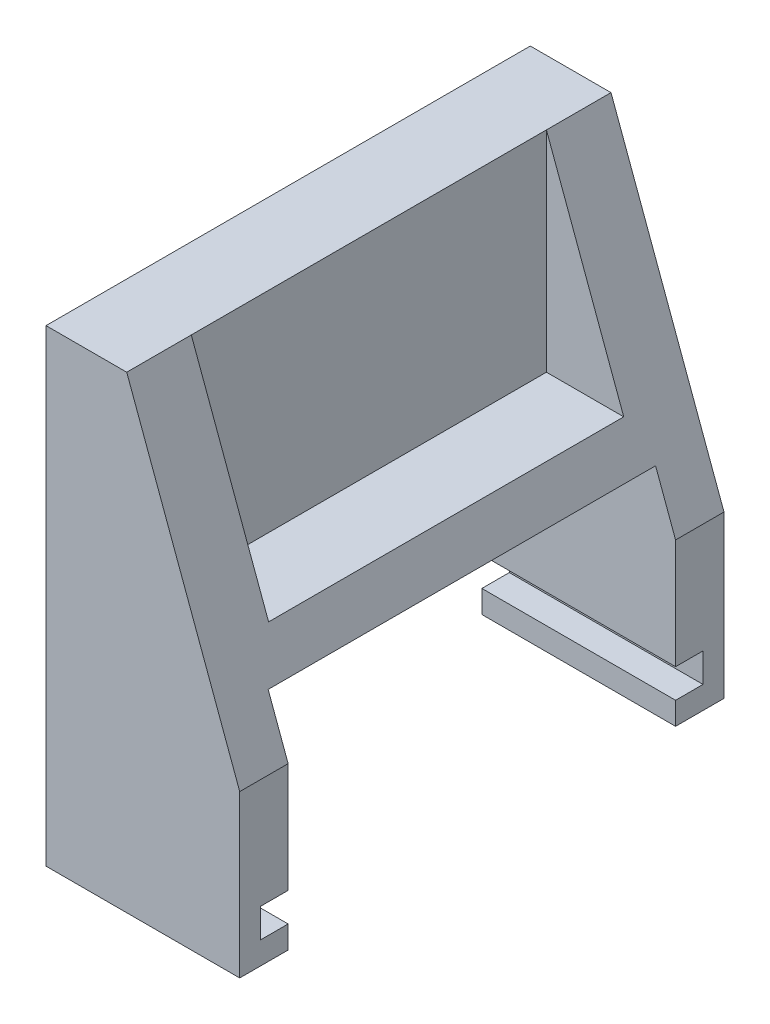
ISO-10303-21;
HEADER;
FILE_DESCRIPTION(('STEP AP214'),'2;1');
FILE_NAME('part.step','',(''),(''),'','','');
FILE_SCHEMA(('AUTOMOTIVE_DESIGN { 1 0 10303 214 1 1 1 1 }'));
ENDSEC;
DATA;
#1=APPLICATION_CONTEXT('core data for automotive mechanical design processes');
#2=APPLICATION_PROTOCOL_DEFINITION('international standard','automotive_design',2000,#1);
#3=PRODUCT_CONTEXT('',#1,'mechanical');
#4=PRODUCT('Part','Part','',(#3));
#5=PRODUCT_RELATED_PRODUCT_CATEGORY('part','',(#4));
#6=PRODUCT_DEFINITION_FORMATION('','',#4);
#7=PRODUCT_DEFINITION_CONTEXT('part definition',#1,'design');
#8=PRODUCT_DEFINITION('design','',#6,#7);
#9=PRODUCT_DEFINITION_SHAPE('','',#8);
#10=(LENGTH_UNIT() NAMED_UNIT(*) SI_UNIT(.MILLI.,.METRE.));
#11=(NAMED_UNIT(*) PLANE_ANGLE_UNIT() SI_UNIT($,.RADIAN.));
#12=(NAMED_UNIT(*) SI_UNIT($,.STERADIAN.) SOLID_ANGLE_UNIT());
#13=UNCERTAINTY_MEASURE_WITH_UNIT(LENGTH_MEASURE(1.E-05),#10,'distance_accuracy_value','');
#14=(GEOMETRIC_REPRESENTATION_CONTEXT(3) GLOBAL_UNCERTAINTY_ASSIGNED_CONTEXT((#13)) GLOBAL_UNIT_ASSIGNED_CONTEXT((#10,
#11,#12)) REPRESENTATION_CONTEXT('',''));
#15=CARTESIAN_POINT('',(0.,0.,0.));
#16=DIRECTION('',(0.,0.,1.));
#17=DIRECTION('',(1.,0.,0.));
#18=AXIS2_PLACEMENT_3D('',#15,#16,#17);
#19=CARTESIAN_POINT('',(12.,-29.,-30.));
#20=DIRECTION('',(1.,0.,0.));
#21=DIRECTION('',(0.,0.,-1.));
#22=AXIS2_PLACEMENT_3D('',#19,#20,#21);
#23=PLANE('',#22);
#24=DIRECTION('',(0.,-1.,0.));
#25=VECTOR('',#24,1.);
#26=CARTESIAN_POINT('',(12.,-29.,-28.7));
#27=LINE('',#26,#25);
#28=CARTESIAN_POINT('',(12.,-25.8,-28.7));
#29=VERTEX_POINT('',#28);
#30=CARTESIAN_POINT('',(12.,-27.6,-28.7));
#31=VERTEX_POINT('',#30);
#32=EDGE_CURVE('E361',#29,#31,#27,.T.);
#33=ORIENTED_EDGE('',*,*,#32,.T.);
#34=DIRECTION('',(0.,0.,1.));
#35=VECTOR('',#34,1.);
#36=CARTESIAN_POINT('',(12.,-27.6,-30.));
#37=LINE('',#36,#35);
#38=CARTESIAN_POINT('',(12.,-27.6,-27.));
#39=VERTEX_POINT('',#38);
#40=EDGE_CURVE('E364',#31,#39,#37,.T.);
#41=ORIENTED_EDGE('',*,*,#40,.T.);
#42=DIRECTION('',(0.,1.,0.));
#43=VECTOR('',#42,1.);
#44=CARTESIAN_POINT('',(12.,-29.,-27.));
#45=LINE('',#44,#43);
#46=CARTESIAN_POINT('',(12.,-29.,-27.));
#47=VERTEX_POINT('',#46);
#48=EDGE_CURVE('E282',#47,#39,#45,.T.);
#49=ORIENTED_EDGE('',*,*,#48,.F.);
#50=DIRECTION('',(0.,0.,1.));
#51=VECTOR('',#50,1.);
#52=CARTESIAN_POINT('',(12.,-29.,-30.));
#53=LINE('',#52,#51);
#54=CARTESIAN_POINT('',(12.,-29.,-30.));
#55=VERTEX_POINT('',#54);
#56=EDGE_CURVE('E224',#55,#47,#53,.T.);
#57=ORIENTED_EDGE('',*,*,#56,.F.);
#58=DIRECTION('',(0.,1.,0.));
#59=VECTOR('',#58,1.);
#60=CARTESIAN_POINT('',(12.,-29.,-30.));
#61=LINE('',#60,#59);
#62=CARTESIAN_POINT('',(12.,-19.,-30.));
#63=VERTEX_POINT('',#62);
#64=EDGE_CURVE('E296',#55,#63,#61,.T.);
#65=ORIENTED_EDGE('',*,*,#64,.T.);
#66=DIRECTION('',(0.,0.,1.));
#67=VECTOR('',#66,1.);
#68=CARTESIAN_POINT('',(12.,-19.,-30.));
#69=LINE('',#68,#67);
#70=CARTESIAN_POINT('',(12.,-19.,-27.));
#71=VERTEX_POINT('',#70);
#72=EDGE_CURVE('E216',#63,#71,#69,.T.);
#73=ORIENTED_EDGE('',*,*,#72,.T.);
#74=CARTESIAN_POINT('',(12.,-25.8,-27.));
#75=VERTEX_POINT('',#74);
#76=EDGE_CURVE('E281',#75,#71,#45,.T.);
#77=ORIENTED_EDGE('',*,*,#76,.F.);
#78=DIRECTION('',(0.,0.,-1.));
#79=VECTOR('',#78,1.);
#80=CARTESIAN_POINT('',(12.,-25.8,-30.));
#81=LINE('',#80,#79);
#82=EDGE_CURVE('E60',#75,#29,#81,.T.);
#83=ORIENTED_EDGE('',*,*,#82,.T.);
#84=EDGE_LOOP('',(#33,#41,#49,#57,#65,#73,#77,#83));
#85=FACE_BOUND('',#84,.T.);
#86=ADVANCED_FACE('F37',(#85),#23,.T.);
#87=CARTESIAN_POINT('',(0.,0.,-30.));
#88=DIRECTION('',(-1.,0.,0.));
#89=DIRECTION('',(0.,-1.,0.));
#90=AXIS2_PLACEMENT_3D('',#87,#88,#89);
#91=PLANE('',#90);
#92=DIRECTION('',(0.,-1.,0.));
#93=VECTOR('',#92,1.);
#94=CARTESIAN_POINT('',(0.,-15.6385994006733,-27.));
#95=LINE('',#94,#93);
#96=CARTESIAN_POINT('',(0.,-27.6,-27.));
#97=VERTEX_POINT('',#96);
#98=CARTESIAN_POINT('',(0.,-29.,-27.));
#99=VERTEX_POINT('',#98);
#100=EDGE_CURVE('E258',#97,#99,#95,.T.);
#101=ORIENTED_EDGE('',*,*,#100,.F.);
#102=DIRECTION('',(0.,0.,-1.));
#103=VECTOR('',#102,1.);
#104=CARTESIAN_POINT('',(0.,-27.6,-27.));
#105=LINE('',#104,#103);
#106=CARTESIAN_POINT('',(0.,-27.6,-28.7));
#107=VERTEX_POINT('',#106);
#108=EDGE_CURVE('E371',#97,#107,#105,.T.);
#109=ORIENTED_EDGE('',*,*,#108,.T.);
#110=DIRECTION('',(0.,1.,0.));
#111=VECTOR('',#110,1.);
#112=CARTESIAN_POINT('',(0.,-25.8,-28.7));
#113=LINE('',#112,#111);
#114=CARTESIAN_POINT('',(0.,-25.8,-28.7));
#115=VERTEX_POINT('',#114);
#116=EDGE_CURVE('E250',#107,#115,#113,.T.);
#117=ORIENTED_EDGE('',*,*,#116,.T.);
#118=DIRECTION('',(0.,0.,1.));
#119=VECTOR('',#118,1.);
#120=CARTESIAN_POINT('',(0.,-25.8,-27.));
#121=LINE('',#120,#119);
#122=CARTESIAN_POINT('',(0.,-25.8,-27.));
#123=VERTEX_POINT('',#122);
#124=EDGE_CURVE('E237',#115,#123,#121,.T.);
#125=ORIENTED_EDGE('',*,*,#124,.T.);
#126=CARTESIAN_POINT('',(0.,-15.6385994006733,-27.));
#127=VERTEX_POINT('',#126);
#128=EDGE_CURVE('E247',#127,#123,#95,.T.);
#129=ORIENTED_EDGE('',*,*,#128,.F.);
#130=DIRECTION('',(0.,0.,1.));
#131=VECTOR('',#130,1.);
#132=CARTESIAN_POINT('',(0.,-15.6385994006733,-27.));
#133=LINE('',#132,#131);
#134=CARTESIAN_POINT('',(0.,-15.6385994006733,-3.));
#135=VERTEX_POINT('',#134);
#136=EDGE_CURVE('E261',#127,#135,#133,.T.);
#137=ORIENTED_EDGE('',*,*,#136,.T.);
#138=DIRECTION('',(0.,-1.,0.));
#139=VECTOR('',#138,1.);
#140=CARTESIAN_POINT('',(0.,-15.6385994006733,-3.));
#141=LINE('',#140,#139);
#142=CARTESIAN_POINT('',(0.,-25.8,-3.));
#143=VERTEX_POINT('',#142);
#144=EDGE_CURVE('E340',#135,#143,#141,.T.);
#145=ORIENTED_EDGE('',*,*,#144,.T.);
#146=DIRECTION('',(0.,0.,-1.));
#147=VECTOR('',#146,1.);
#148=CARTESIAN_POINT('',(0.,-25.8,-3.));
#149=LINE('',#148,#147);
#150=CARTESIAN_POINT('',(0.,-25.8,-1.3));
#151=VERTEX_POINT('',#150);
#152=EDGE_CURVE('E352',#151,#143,#149,.T.);
#153=ORIENTED_EDGE('',*,*,#152,.F.);
#154=DIRECTION('',(0.,1.,0.));
#155=VECTOR('',#154,1.);
#156=CARTESIAN_POINT('',(0.,-25.8,-1.3));
#157=LINE('',#156,#155);
#158=CARTESIAN_POINT('',(0.,-27.6,-1.3));
#159=VERTEX_POINT('',#158);
#160=EDGE_CURVE('E355',#159,#151,#157,.T.);
#161=ORIENTED_EDGE('',*,*,#160,.F.);
#162=DIRECTION('',(0.,0.,1.));
#163=VECTOR('',#162,1.);
#164=CARTESIAN_POINT('',(0.,-27.6,-3.));
#165=LINE('',#164,#163);
#166=CARTESIAN_POINT('',(0.,-27.6,-3.));
#167=VERTEX_POINT('',#166);
#168=EDGE_CURVE('E358',#167,#159,#165,.T.);
#169=ORIENTED_EDGE('',*,*,#168,.F.);
#170=CARTESIAN_POINT('',(0.,-29.,-3.));
#171=VERTEX_POINT('',#170);
#172=EDGE_CURVE('E341',#167,#171,#141,.T.);
#173=ORIENTED_EDGE('',*,*,#172,.T.);
#174=DIRECTION('',(0.,0.,1.));
#175=VECTOR('',#174,1.);
#176=CARTESIAN_POINT('',(0.,-29.,-30.));
#177=LINE('',#176,#175);
#178=CARTESIAN_POINT('',(0.,-29.,0.));
#179=VERTEX_POINT('',#178);
#180=EDGE_CURVE('E231',#171,#179,#177,.T.);
#181=ORIENTED_EDGE('',*,*,#180,.T.);
#182=DIRECTION('',(0.,-1.,0.));
#183=VECTOR('',#182,1.);
#184=CARTESIAN_POINT('',(0.,0.,0.));
#185=LINE('',#184,#183);
#186=CARTESIAN_POINT('',(0.,0.,0.));
#187=VERTEX_POINT('',#186);
#188=EDGE_CURVE('E302',#187,#179,#185,.T.);
#189=ORIENTED_EDGE('',*,*,#188,.F.);
#190=DIRECTION('',(0.,0.,1.));
#191=VECTOR('',#190,1.);
#192=CARTESIAN_POINT('',(0.,0.,-30.));
#193=LINE('',#192,#191);
#194=CARTESIAN_POINT('',(0.,0.,-30.));
#195=VERTEX_POINT('',#194);
#196=EDGE_CURVE('E232',#195,#187,#193,.T.);
#197=ORIENTED_EDGE('',*,*,#196,.F.);
#198=DIRECTION('',(0.,-1.,0.));
#199=VECTOR('',#198,1.);
#200=CARTESIAN_POINT('',(0.,0.,-30.));
#201=LINE('',#200,#199);
#202=CARTESIAN_POINT('',(0.,-29.,-30.));
#203=VERTEX_POINT('',#202);
#204=EDGE_CURVE('E290',#195,#203,#201,.T.);
#205=ORIENTED_EDGE('',*,*,#204,.T.);
#206=EDGE_CURVE('E228',#203,#99,#177,.T.);
#207=ORIENTED_EDGE('',*,*,#206,.T.);
#208=EDGE_LOOP('',(#101,#109,#117,#125,#129,#137,#145,#153,#161,#169,#173,#181,#189,#197,#205,#207));
#209=FACE_BOUND('',#208,.T.);
#210=ADVANCED_FACE('F245',(#209),#91,.T.);
#211=CARTESIAN_POINT('',(25.,-15.6385994006733,-27.));
#212=DIRECTION('',(0.,0.,-1.));
#213=DIRECTION('',(0.,1.,0.));
#214=AXIS2_PLACEMENT_3D('',#211,#212,#213);
#215=PLANE('',#214);
#216=DIRECTION('',(1.,0.,0.));
#217=VECTOR('',#216,1.);
#218=CARTESIAN_POINT('',(25.,-27.6,-27.));
#219=LINE('',#218,#217);
#220=EDGE_CURVE('E11',#97,#39,#219,.T.);
#221=ORIENTED_EDGE('',*,*,#220,.F.);
#222=ORIENTED_EDGE('',*,*,#100,.T.);
#223=DIRECTION('',(1.,0.,0.));
#224=VECTOR('',#223,1.);
#225=CARTESIAN_POINT('',(0.,-29.,-27.));
#226=LINE('',#225,#224);
#227=EDGE_CURVE('E279',#99,#47,#226,.T.);
#228=ORIENTED_EDGE('',*,*,#227,.T.);
#229=ORIENTED_EDGE('',*,*,#48,.T.);
#230=EDGE_LOOP('',(#221,#222,#228,#229));
#231=FACE_BOUND('',#230,.T.);
#232=ADVANCED_FACE('F400',(#231),#215,.F.);
#233=DIRECTION('',(-1.,0.,0.));
#234=VECTOR('',#233,1.);
#235=CARTESIAN_POINT('',(25.,-25.8,-27.));
#236=LINE('',#235,#234);
#237=EDGE_CURVE('E45',#75,#123,#236,.T.);
#238=ORIENTED_EDGE('',*,*,#237,.F.);
#239=ORIENTED_EDGE('',*,*,#76,.T.);
#240=DIRECTION('',(-0.345705358827356,0.93834311681711,0.));
#241=VECTOR('',#240,1.);
#242=CARTESIAN_POINT('',(12.,-19.,-27.));
#243=LINE('',#242,#241);
#244=CARTESIAN_POINT('',(10.7615892528796,-15.6385994006733,-27.));
#245=VERTEX_POINT('',#244);
#246=EDGE_CURVE('E285',#71,#245,#243,.T.);
#247=ORIENTED_EDGE('',*,*,#246,.T.);
#248=DIRECTION('',(-1.,0.,0.));
#249=VECTOR('',#248,1.);
#250=CARTESIAN_POINT('',(25.,-15.6385994006733,-27.));
#251=LINE('',#250,#249);
#252=EDGE_CURVE('E255',#245,#127,#251,.T.);
#253=ORIENTED_EDGE('',*,*,#252,.T.);
#254=ORIENTED_EDGE('',*,*,#128,.T.);
#255=EDGE_LOOP('',(#238,#239,#247,#253,#254));
#256=FACE_BOUND('',#255,.T.);
#257=ADVANCED_FACE('F253',(#256),#215,.F.);
#258=CARTESIAN_POINT('',(25.,-15.6385994006733,-3.));
#259=DIRECTION('',(0.,0.,-1.));
#260=DIRECTION('',(-1.,0.,0.));
#261=AXIS2_PLACEMENT_3D('',#258,#259,#260);
#262=PLANE('',#261);
#263=DIRECTION('',(1.,0.,0.));
#264=VECTOR('',#263,1.);
#265=CARTESIAN_POINT('',(25.,-25.8,-3.));
#266=LINE('',#265,#264);
#267=CARTESIAN_POINT('',(12.,-25.8,-3.));
#268=VERTEX_POINT('',#267);
#269=EDGE_CURVE('E214',#143,#268,#266,.T.);
#270=ORIENTED_EDGE('',*,*,#269,.F.);
#271=ORIENTED_EDGE('',*,*,#144,.F.);
#272=DIRECTION('',(-1.,0.,0.));
#273=VECTOR('',#272,1.);
#274=CARTESIAN_POINT('',(25.,-15.6385994006733,-3.));
#275=LINE('',#274,#273);
#276=CARTESIAN_POINT('',(10.7615892528796,-15.6385994006733,-3.));
#277=VERTEX_POINT('',#276);
#278=EDGE_CURVE('E257',#277,#135,#275,.T.);
#279=ORIENTED_EDGE('',*,*,#278,.F.);
#280=DIRECTION('',(-0.345705358827356,0.93834311681711,0.));
#281=VECTOR('',#280,1.);
#282=CARTESIAN_POINT('',(12.,-19.,-3.));
#283=LINE('',#282,#281);
#284=CARTESIAN_POINT('',(12.,-19.,-3.));
#285=VERTEX_POINT('',#284);
#286=EDGE_CURVE('E273',#285,#277,#283,.T.);
#287=ORIENTED_EDGE('',*,*,#286,.F.);
#288=DIRECTION('',(0.,1.,0.));
#289=VECTOR('',#288,1.);
#290=CARTESIAN_POINT('',(12.,-29.,-3.));
#291=LINE('',#290,#289);
#292=EDGE_CURVE('E269',#268,#285,#291,.T.);
#293=ORIENTED_EDGE('',*,*,#292,.F.);
#294=EDGE_LOOP('',(#270,#271,#279,#287,#293));
#295=FACE_BOUND('',#294,.T.);
#296=ADVANCED_FACE('F334',(#295),#262,.T.);
#297=DIRECTION('',(0.,0.,1.));
#298=VECTOR('',#297,1.);
#299=CARTESIAN_POINT('',(12.,-25.8,-30.));
#300=LINE('',#299,#298);
#301=CARTESIAN_POINT('',(12.,-25.8,-1.3));
#302=VERTEX_POINT('',#301);
#303=EDGE_CURVE('E330',#268,#302,#300,.T.);
#304=ORIENTED_EDGE('',*,*,#303,.F.);
#305=ORIENTED_EDGE('',*,*,#292,.T.);
#306=CARTESIAN_POINT('',(12.,-19.,0.));
#307=VERTEX_POINT('',#306);
#308=EDGE_CURVE('E223',#285,#307,#69,.T.);
#309=ORIENTED_EDGE('',*,*,#308,.T.);
#310=DIRECTION('',(0.,1.,0.));
#311=VECTOR('',#310,1.);
#312=CARTESIAN_POINT('',(12.,-29.,0.));
#313=LINE('',#312,#311);
#314=CARTESIAN_POINT('',(12.,-29.,0.));
#315=VERTEX_POINT('',#314);
#316=EDGE_CURVE('E307',#315,#307,#313,.T.);
#317=ORIENTED_EDGE('',*,*,#316,.F.);
#318=CARTESIAN_POINT('',(12.,-29.,-3.));
#319=VERTEX_POINT('',#318);
#320=EDGE_CURVE('E227',#319,#315,#53,.T.);
#321=ORIENTED_EDGE('',*,*,#320,.F.);
#322=CARTESIAN_POINT('',(12.,-27.6,-3.));
#323=VERTEX_POINT('',#322);
#324=EDGE_CURVE('E270',#319,#323,#291,.T.);
#325=ORIENTED_EDGE('',*,*,#324,.T.);
#326=DIRECTION('',(0.,0.,-1.));
#327=VECTOR('',#326,1.);
#328=CARTESIAN_POINT('',(12.,-27.6,-30.));
#329=LINE('',#328,#327);
#330=CARTESIAN_POINT('',(12.,-27.6,-1.3));
#331=VERTEX_POINT('',#330);
#332=EDGE_CURVE('E347',#331,#323,#329,.T.);
#333=ORIENTED_EDGE('',*,*,#332,.F.);
#334=DIRECTION('',(0.,-1.,0.));
#335=VECTOR('',#334,1.);
#336=CARTESIAN_POINT('',(12.,-29.,-1.3));
#337=LINE('',#336,#335);
#338=EDGE_CURVE('E343',#302,#331,#337,.T.);
#339=ORIENTED_EDGE('',*,*,#338,.F.);
#340=EDGE_LOOP('',(#304,#305,#309,#317,#321,#325,#333,#339));
#341=FACE_BOUND('',#340,.T.);
#342=ADVANCED_FACE('F326',(#341),#23,.T.);
#343=CARTESIAN_POINT('',(0.,-29.,-30.));
#344=DIRECTION('',(0.,-1.,0.));
#345=DIRECTION('',(0.,0.,-1.));
#346=AXIS2_PLACEMENT_3D('',#343,#344,#345);
#347=PLANE('',#346);
#348=ORIENTED_EDGE('',*,*,#180,.F.);
#349=DIRECTION('',(1.,0.,0.));
#350=VECTOR('',#349,1.);
#351=CARTESIAN_POINT('',(0.,-29.,-3.));
#352=LINE('',#351,#350);
#353=EDGE_CURVE('E265',#171,#319,#352,.T.);
#354=ORIENTED_EDGE('',*,*,#353,.T.);
#355=ORIENTED_EDGE('',*,*,#320,.T.);
#356=DIRECTION('',(1.,0.,0.));
#357=VECTOR('',#356,1.);
#358=CARTESIAN_POINT('',(0.,-29.,0.));
#359=LINE('',#358,#357);
#360=EDGE_CURVE('E305',#179,#315,#359,.T.);
#361=ORIENTED_EDGE('',*,*,#360,.F.);
#362=EDGE_LOOP('',(#348,#354,#355,#361));
#363=FACE_BOUND('',#362,.T.);
#364=ADVANCED_FACE('F321',(#363),#347,.T.);
#365=CARTESIAN_POINT('',(5.,0.,-30.));
#366=DIRECTION('',(0.,1.,0.));
#367=DIRECTION('',(-1.,0.,0.));
#368=AXIS2_PLACEMENT_3D('',#365,#366,#367);
#369=PLANE('',#368);
#370=DIRECTION('',(-1.,0.,0.));
#371=VECTOR('',#370,1.);
#372=CARTESIAN_POINT('',(5.,0.,0.));
#373=LINE('',#372,#371);
#374=CARTESIAN_POINT('',(5.,0.,0.));
#375=VERTEX_POINT('',#374);
#376=EDGE_CURVE('E287',#375,#187,#373,.T.);
#377=ORIENTED_EDGE('',*,*,#376,.F.);
#378=DIRECTION('',(0.,0.,1.));
#379=VECTOR('',#378,1.);
#380=CARTESIAN_POINT('',(5.,0.,-30.));
#381=LINE('',#380,#379);
#382=CARTESIAN_POINT('',(5.,0.,-4.));
#383=VERTEX_POINT('',#382);
#384=EDGE_CURVE('E206',#383,#375,#381,.T.);
#385=ORIENTED_EDGE('',*,*,#384,.F.);
#386=DIRECTION('',(0.,0.,1.));
#387=VECTOR('',#386,1.);
#388=CARTESIAN_POINT('',(5.,0.,-26.));
#389=LINE('',#388,#387);
#390=CARTESIAN_POINT('',(5.,0.,-26.));
#391=VERTEX_POINT('',#390);
#392=EDGE_CURVE('E184',#391,#383,#389,.T.);
#393=ORIENTED_EDGE('',*,*,#392,.F.);
#394=CARTESIAN_POINT('',(5.,0.,-30.));
#395=VERTEX_POINT('',#394);
#396=EDGE_CURVE('E204',#395,#391,#381,.T.);
#397=ORIENTED_EDGE('',*,*,#396,.F.);
#398=DIRECTION('',(-1.,0.,0.));
#399=VECTOR('',#398,1.);
#400=CARTESIAN_POINT('',(5.,0.,-30.));
#401=LINE('',#400,#399);
#402=EDGE_CURVE('E288',#395,#195,#401,.T.);
#403=ORIENTED_EDGE('',*,*,#402,.T.);
#404=ORIENTED_EDGE('',*,*,#196,.T.);
#405=EDGE_LOOP('',(#377,#385,#393,#397,#403,#404));
#406=FACE_BOUND('',#405,.T.);
#407=ADVANCED_FACE('F39',(#406),#369,.T.);
#408=CARTESIAN_POINT('',(12.,-19.,-30.));
#409=DIRECTION('',(0.93834311681711,0.345705358827356,0.));
#410=DIRECTION('',(-0.345705358827356,0.93834311681711,0.));
#411=AXIS2_PLACEMENT_3D('',#408,#409,#410);
#412=PLANE('',#411);
#413=DIRECTION('',(-0.345705358827357,0.93834311681711,0.));
#414=VECTOR('',#413,1.);
#415=CARTESIAN_POINT('',(9.78947368421053,-13.,-26.));
#416=LINE('',#415,#414);
#417=CARTESIAN_POINT('',(9.78947368421053,-13.,-26.));
#418=VERTEX_POINT('',#417);
#419=EDGE_CURVE('E191',#418,#391,#416,.T.);
#420=ORIENTED_EDGE('',*,*,#419,.F.);
#421=DIRECTION('',(0.,0.,1.));
#422=VECTOR('',#421,1.);
#423=CARTESIAN_POINT('',(9.78947368421053,-13.,-26.));
#424=LINE('',#423,#422);
#425=CARTESIAN_POINT('',(9.78947368421053,-13.,-4.));
#426=VERTEX_POINT('',#425);
#427=EDGE_CURVE('E251',#418,#426,#424,.T.);
#428=ORIENTED_EDGE('',*,*,#427,.T.);
#429=DIRECTION('',(-0.345705358827357,0.93834311681711,0.));
#430=VECTOR('',#429,1.);
#431=CARTESIAN_POINT('',(9.78947368421053,-13.,-4.));
#432=LINE('',#431,#430);
#433=EDGE_CURVE('E315',#426,#383,#432,.T.);
#434=ORIENTED_EDGE('',*,*,#433,.T.);
#435=ORIENTED_EDGE('',*,*,#384,.T.);
#436=DIRECTION('',(-0.345705358827356,0.93834311681711,0.));
#437=VECTOR('',#436,1.);
#438=CARTESIAN_POINT('',(12.,-19.,0.));
#439=LINE('',#438,#437);
#440=EDGE_CURVE('E219',#307,#375,#439,.T.);
#441=ORIENTED_EDGE('',*,*,#440,.F.);
#442=ORIENTED_EDGE('',*,*,#308,.F.);
#443=ORIENTED_EDGE('',*,*,#286,.T.);
#444=DIRECTION('',(0.,0.,-1.));
#445=VECTOR('',#444,1.);
#446=CARTESIAN_POINT('',(10.7615892528796,-15.6385994006733,-30.));
#447=LINE('',#446,#445);
#448=EDGE_CURVE('E276',#277,#245,#447,.T.);
#449=ORIENTED_EDGE('',*,*,#448,.T.);
#450=ORIENTED_EDGE('',*,*,#246,.F.);
#451=ORIENTED_EDGE('',*,*,#72,.F.);
#452=DIRECTION('',(-0.345705358827356,0.93834311681711,0.));
#453=VECTOR('',#452,1.);
#454=CARTESIAN_POINT('',(12.,-19.,-30.));
#455=LINE('',#454,#453);
#456=EDGE_CURVE('E211',#63,#395,#455,.T.);
#457=ORIENTED_EDGE('',*,*,#456,.T.);
#458=ORIENTED_EDGE('',*,*,#396,.T.);
#459=EDGE_LOOP('',(#420,#428,#434,#435,#441,#442,#443,#449,#450,#451,#457,#458));
#460=FACE_BOUND('',#459,.T.);
#461=ADVANCED_FACE('F209',(#460),#412,.T.);
#462=ORIENTED_EDGE('',*,*,#227,.F.);
#463=ORIENTED_EDGE('',*,*,#206,.F.);
#464=DIRECTION('',(1.,0.,0.));
#465=VECTOR('',#464,1.);
#466=CARTESIAN_POINT('',(0.,-29.,-30.));
#467=LINE('',#466,#465);
#468=EDGE_CURVE('E293',#203,#55,#467,.T.);
#469=ORIENTED_EDGE('',*,*,#468,.T.);
#470=ORIENTED_EDGE('',*,*,#56,.T.);
#471=EDGE_LOOP('',(#462,#463,#469,#470));
#472=FACE_BOUND('',#471,.T.);
#473=ADVANCED_FACE('F408',(#472),#347,.T.);
#474=CARTESIAN_POINT('',(0.,0.,-30.));
#475=DIRECTION('',(0.,0.,1.));
#476=DIRECTION('',(1.,0.,0.));
#477=AXIS2_PLACEMENT_3D('',#474,#475,#476);
#478=PLANE('',#477);
#479=ORIENTED_EDGE('',*,*,#402,.F.);
#480=ORIENTED_EDGE('',*,*,#456,.F.);
#481=ORIENTED_EDGE('',*,*,#64,.F.);
#482=ORIENTED_EDGE('',*,*,#468,.F.);
#483=ORIENTED_EDGE('',*,*,#204,.F.);
#484=EDGE_LOOP('',(#479,#480,#481,#482,#483));
#485=FACE_BOUND('',#484,.T.);
#486=ADVANCED_FACE('F456',(#485),#478,.F.);
#487=CARTESIAN_POINT('',(0.,0.,0.));
#488=DIRECTION('',(0.,0.,1.));
#489=DIRECTION('',(1.,0.,0.));
#490=AXIS2_PLACEMENT_3D('',#487,#488,#489);
#491=PLANE('',#490);
#492=ORIENTED_EDGE('',*,*,#376,.T.);
#493=ORIENTED_EDGE('',*,*,#188,.T.);
#494=ORIENTED_EDGE('',*,*,#360,.T.);
#495=ORIENTED_EDGE('',*,*,#316,.T.);
#496=ORIENTED_EDGE('',*,*,#440,.T.);
#497=EDGE_LOOP('',(#492,#493,#494,#495,#496));
#498=FACE_BOUND('',#497,.T.);
#499=ADVANCED_FACE('F313',(#498),#491,.T.);
#500=CARTESIAN_POINT('',(25.,-15.6385994006733,-27.));
#501=DIRECTION('',(0.,-1.,0.));
#502=DIRECTION('',(0.,0.,-1.));
#503=AXIS2_PLACEMENT_3D('',#500,#501,#502);
#504=PLANE('',#503);
#505=ORIENTED_EDGE('',*,*,#278,.T.);
#506=ORIENTED_EDGE('',*,*,#136,.F.);
#507=ORIENTED_EDGE('',*,*,#252,.F.);
#508=ORIENTED_EDGE('',*,*,#448,.F.);
#509=EDGE_LOOP('',(#505,#506,#507,#508));
#510=FACE_BOUND('',#509,.T.);
#511=ADVANCED_FACE('F338',(#510),#504,.T.);
#512=DIRECTION('',(-1.,0.,0.));
#513=VECTOR('',#512,1.);
#514=CARTESIAN_POINT('',(25.,-27.6,-3.));
#515=LINE('',#514,#513);
#516=EDGE_CURVE('E212',#323,#167,#515,.T.);
#517=ORIENTED_EDGE('',*,*,#516,.F.);
#518=ORIENTED_EDGE('',*,*,#324,.F.);
#519=ORIENTED_EDGE('',*,*,#353,.F.);
#520=ORIENTED_EDGE('',*,*,#172,.F.);
#521=EDGE_LOOP('',(#517,#518,#519,#520));
#522=FACE_BOUND('',#521,.T.);
#523=ADVANCED_FACE('F410',(#522),#262,.T.);
#524=CARTESIAN_POINT('',(15.,-25.8,-3.));
#525=DIRECTION('',(0.,1.,0.));
#526=DIRECTION('',(0.,0.,1.));
#527=AXIS2_PLACEMENT_3D('',#524,#525,#526);
#528=PLANE('',#527);
#529=ORIENTED_EDGE('',*,*,#303,.T.);
#530=DIRECTION('',(-1.,0.,0.));
#531=VECTOR('',#530,1.);
#532=CARTESIAN_POINT('',(15.,-25.8,-1.3));
#533=LINE('',#532,#531);
#534=EDGE_CURVE('E349',#302,#151,#533,.T.);
#535=ORIENTED_EDGE('',*,*,#534,.T.);
#536=ORIENTED_EDGE('',*,*,#152,.T.);
#537=ORIENTED_EDGE('',*,*,#269,.T.);
#538=EDGE_LOOP('',(#529,#535,#536,#537));
#539=FACE_BOUND('',#538,.T.);
#540=ADVANCED_FACE('F418',(#539),#528,.F.);
#541=CARTESIAN_POINT('',(15.,-25.8,-1.3));
#542=DIRECTION('',(0.,0.,1.));
#543=DIRECTION('',(0.,-1.,0.));
#544=AXIS2_PLACEMENT_3D('',#541,#542,#543);
#545=PLANE('',#544);
#546=ORIENTED_EDGE('',*,*,#338,.T.);
#547=DIRECTION('',(-1.,0.,0.));
#548=VECTOR('',#547,1.);
#549=CARTESIAN_POINT('',(15.,-27.6,-1.3));
#550=LINE('',#549,#548);
#551=EDGE_CURVE('E350',#331,#159,#550,.T.);
#552=ORIENTED_EDGE('',*,*,#551,.T.);
#553=ORIENTED_EDGE('',*,*,#160,.T.);
#554=ORIENTED_EDGE('',*,*,#534,.F.);
#555=EDGE_LOOP('',(#546,#552,#553,#554));
#556=FACE_BOUND('',#555,.T.);
#557=ADVANCED_FACE('F424',(#556),#545,.F.);
#558=CARTESIAN_POINT('',(15.,-27.6,-3.));
#559=DIRECTION('',(0.,-1.,0.));
#560=DIRECTION('',(0.,0.,-1.));
#561=AXIS2_PLACEMENT_3D('',#558,#559,#560);
#562=PLANE('',#561);
#563=ORIENTED_EDGE('',*,*,#332,.T.);
#564=ORIENTED_EDGE('',*,*,#516,.T.);
#565=ORIENTED_EDGE('',*,*,#168,.T.);
#566=ORIENTED_EDGE('',*,*,#551,.F.);
#567=EDGE_LOOP('',(#563,#564,#565,#566));
#568=FACE_BOUND('',#567,.T.);
#569=ADVANCED_FACE('F433',(#568),#562,.F.);
#570=CARTESIAN_POINT('',(15.,-27.6,-27.));
#571=DIRECTION('',(0.,1.,0.));
#572=DIRECTION('',(0.,0.,1.));
#573=AXIS2_PLACEMENT_3D('',#570,#571,#572);
#574=PLANE('',#573);
#575=DIRECTION('',(-1.,0.,0.));
#576=VECTOR('',#575,1.);
#577=CARTESIAN_POINT('',(15.,-27.6,-28.7));
#578=LINE('',#577,#576);
#579=EDGE_CURVE('E368',#31,#107,#578,.T.);
#580=ORIENTED_EDGE('',*,*,#579,.T.);
#581=ORIENTED_EDGE('',*,*,#108,.F.);
#582=ORIENTED_EDGE('',*,*,#220,.T.);
#583=ORIENTED_EDGE('',*,*,#40,.F.);
#584=EDGE_LOOP('',(#580,#581,#582,#583));
#585=FACE_BOUND('',#584,.T.);
#586=ADVANCED_FACE('F442',(#585),#574,.T.);
#587=CARTESIAN_POINT('',(15.,-25.8,-28.7));
#588=DIRECTION('',(0.,0.,1.));
#589=DIRECTION('',(0.,-1.,0.));
#590=AXIS2_PLACEMENT_3D('',#587,#588,#589);
#591=PLANE('',#590);
#592=DIRECTION('',(-1.,0.,0.));
#593=VECTOR('',#592,1.);
#594=CARTESIAN_POINT('',(15.,-25.8,-28.7));
#595=LINE('',#594,#593);
#596=EDGE_CURVE('E369',#29,#115,#595,.T.);
#597=ORIENTED_EDGE('',*,*,#596,.T.);
#598=ORIENTED_EDGE('',*,*,#116,.F.);
#599=ORIENTED_EDGE('',*,*,#579,.F.);
#600=ORIENTED_EDGE('',*,*,#32,.F.);
#601=EDGE_LOOP('',(#597,#598,#599,#600));
#602=FACE_BOUND('',#601,.T.);
#603=ADVANCED_FACE('F391',(#602),#591,.T.);
#604=CARTESIAN_POINT('',(15.,-25.8,-27.));
#605=DIRECTION('',(0.,-1.,0.));
#606=DIRECTION('',(0.,0.,-1.));
#607=AXIS2_PLACEMENT_3D('',#604,#605,#606);
#608=PLANE('',#607);
#609=ORIENTED_EDGE('',*,*,#237,.T.);
#610=ORIENTED_EDGE('',*,*,#124,.F.);
#611=ORIENTED_EDGE('',*,*,#596,.F.);
#612=ORIENTED_EDGE('',*,*,#82,.F.);
#613=EDGE_LOOP('',(#609,#610,#611,#612));
#614=FACE_BOUND('',#613,.T.);
#615=ADVANCED_FACE('F236',(#614),#608,.T.);
#616=CARTESIAN_POINT('',(5.,-13.,-26.));
#617=DIRECTION('',(0.,-1.,0.));
#618=DIRECTION('',(0.,0.,-1.));
#619=AXIS2_PLACEMENT_3D('',#616,#617,#618);
#620=PLANE('',#619);
#621=DIRECTION('',(1.,0.,0.));
#622=VECTOR('',#621,1.);
#623=CARTESIAN_POINT('',(5.,-13.,-4.));
#624=LINE('',#623,#622);
#625=CARTESIAN_POINT('',(5.,-13.,-4.));
#626=VERTEX_POINT('',#625);
#627=EDGE_CURVE('E198',#626,#426,#624,.T.);
#628=ORIENTED_EDGE('',*,*,#627,.T.);
#629=ORIENTED_EDGE('',*,*,#427,.F.);
#630=DIRECTION('',(1.,0.,0.));
#631=VECTOR('',#630,1.);
#632=CARTESIAN_POINT('',(5.,-13.,-26.));
#633=LINE('',#632,#631);
#634=CARTESIAN_POINT('',(5.,-13.,-26.));
#635=VERTEX_POINT('',#634);
#636=EDGE_CURVE('E190',#635,#418,#633,.T.);
#637=ORIENTED_EDGE('',*,*,#636,.F.);
#638=DIRECTION('',(0.,0.,1.));
#639=VECTOR('',#638,1.);
#640=CARTESIAN_POINT('',(5.,-13.,-26.));
#641=LINE('',#640,#639);
#642=EDGE_CURVE('E186',#635,#626,#641,.T.);
#643=ORIENTED_EDGE('',*,*,#642,.T.);
#644=EDGE_LOOP('',(#628,#629,#637,#643));
#645=FACE_BOUND('',#644,.T.);
#646=ADVANCED_FACE('F383',(#645),#620,.F.);
#647=CARTESIAN_POINT('',(5.,0.,-26.));
#648=DIRECTION('',(-1.,0.,0.));
#649=DIRECTION('',(0.,-1.,0.));
#650=AXIS2_PLACEMENT_3D('',#647,#648,#649);
#651=PLANE('',#650);
#652=DIRECTION('',(0.,-1.,0.));
#653=VECTOR('',#652,1.);
#654=CARTESIAN_POINT('',(5.,0.,-4.));
#655=LINE('',#654,#653);
#656=EDGE_CURVE('E52',#383,#626,#655,.T.);
#657=ORIENTED_EDGE('',*,*,#656,.T.);
#658=ORIENTED_EDGE('',*,*,#642,.F.);
#659=DIRECTION('',(0.,-1.,0.));
#660=VECTOR('',#659,1.);
#661=CARTESIAN_POINT('',(5.,0.,-26.));
#662=LINE('',#661,#660);
#663=EDGE_CURVE('E180',#391,#635,#662,.T.);
#664=ORIENTED_EDGE('',*,*,#663,.F.);
#665=ORIENTED_EDGE('',*,*,#392,.T.);
#666=EDGE_LOOP('',(#657,#658,#664,#665));
#667=FACE_BOUND('',#666,.T.);
#668=ADVANCED_FACE('F182',(#667),#651,.F.);
#669=CARTESIAN_POINT('',(0.,0.,-26.));
#670=DIRECTION('',(0.,0.,-1.));
#671=DIRECTION('',(-1.,0.,0.));
#672=AXIS2_PLACEMENT_3D('',#669,#670,#671);
#673=PLANE('',#672);
#674=ORIENTED_EDGE('',*,*,#419,.T.);
#675=ORIENTED_EDGE('',*,*,#663,.T.);
#676=ORIENTED_EDGE('',*,*,#636,.T.);
#677=EDGE_LOOP('',(#674,#675,#676));
#678=FACE_BOUND('',#677,.T.);
#679=ADVANCED_FACE('F194',(#678),#673,.F.);
#680=CARTESIAN_POINT('',(0.,0.,-4.));
#681=DIRECTION('',(0.,0.,-1.));
#682=DIRECTION('',(-1.,0.,0.));
#683=AXIS2_PLACEMENT_3D('',#680,#681,#682);
#684=PLANE('',#683);
#685=ORIENTED_EDGE('',*,*,#433,.F.);
#686=ORIENTED_EDGE('',*,*,#627,.F.);
#687=ORIENTED_EDGE('',*,*,#656,.F.);
#688=EDGE_LOOP('',(#685,#686,#687));
#689=FACE_BOUND('',#688,.T.);
#690=ADVANCED_FACE('F381',(#689),#684,.T.);
#691=CLOSED_SHELL('',(#86,#210,#232,#257,#296,#342,#364,#407,#461,#473,#486,#499,#511,#523,#540,
#557,#569,#586,#603,#615,#646,#668,#679,#690));
#692=MANIFOLD_SOLID_BREP('B2',#691);
#693=ADVANCED_BREP_SHAPE_REPRESENTATION('',(#18,#692),#14);
#694=SHAPE_DEFINITION_REPRESENTATION(#9,#693);
ENDSEC;
END-ISO-10303-21;
